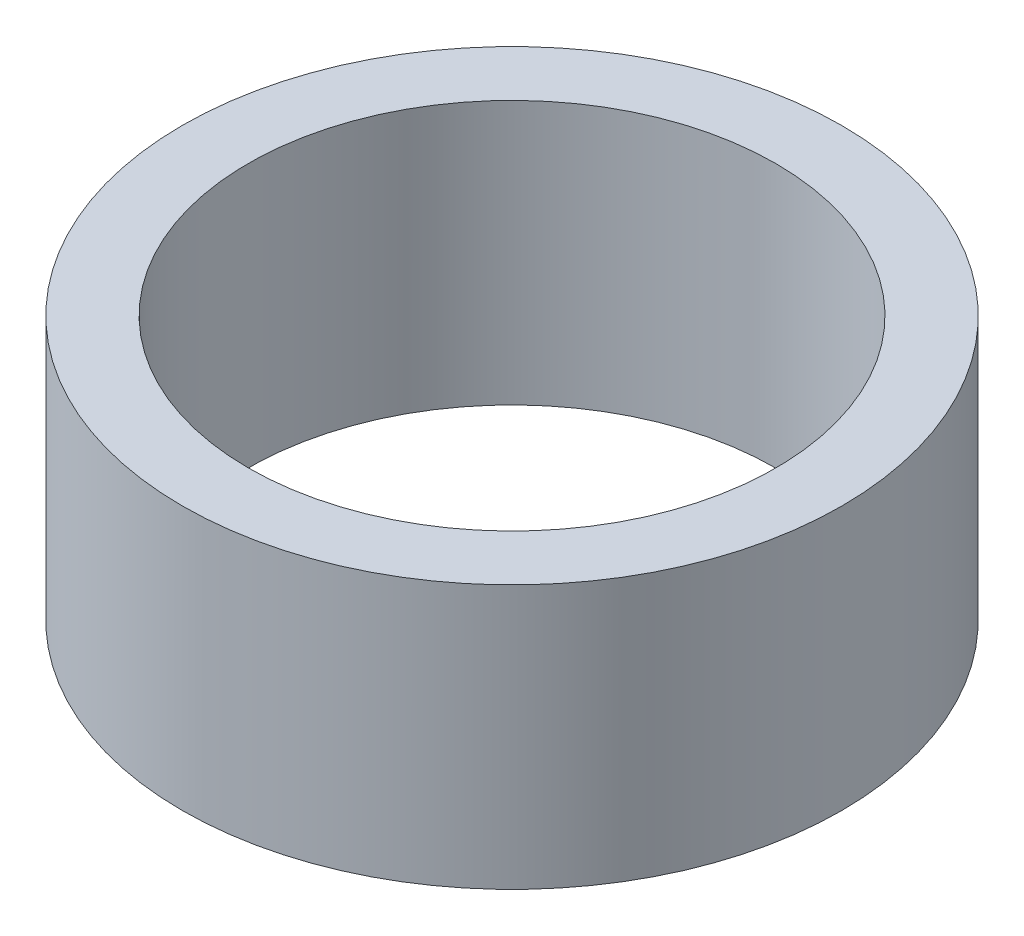
ISO-10303-21;
HEADER;
FILE_DESCRIPTION(('STEP AP214'),'2;1');
FILE_NAME('part.step','',(''),(''),'','','');
FILE_SCHEMA(('AUTOMOTIVE_DESIGN { 1 0 10303 214 1 1 1 1 }'));
ENDSEC;
DATA;
#1=APPLICATION_CONTEXT('core data for automotive mechanical design processes');
#2=APPLICATION_PROTOCOL_DEFINITION('international standard','automotive_design',2000,#1);
#3=PRODUCT_CONTEXT('',#1,'mechanical');
#4=PRODUCT('Part','Part','',(#3));
#5=PRODUCT_RELATED_PRODUCT_CATEGORY('part','',(#4));
#6=PRODUCT_DEFINITION_FORMATION('','',#4);
#7=PRODUCT_DEFINITION_CONTEXT('part definition',#1,'design');
#8=PRODUCT_DEFINITION('design','',#6,#7);
#9=PRODUCT_DEFINITION_SHAPE('','',#8);
#10=(LENGTH_UNIT() NAMED_UNIT(*) SI_UNIT(.MILLI.,.METRE.));
#11=(NAMED_UNIT(*) PLANE_ANGLE_UNIT() SI_UNIT($,.RADIAN.));
#12=(NAMED_UNIT(*) SI_UNIT($,.STERADIAN.) SOLID_ANGLE_UNIT());
#13=UNCERTAINTY_MEASURE_WITH_UNIT(LENGTH_MEASURE(1.E-05),#10,'distance_accuracy_value','');
#14=(GEOMETRIC_REPRESENTATION_CONTEXT(3) GLOBAL_UNCERTAINTY_ASSIGNED_CONTEXT((#13)) GLOBAL_UNIT_ASSIGNED_CONTEXT((#10,
#11,#12)) REPRESENTATION_CONTEXT('',''));
#15=CARTESIAN_POINT('',(0.,0.,0.));
#16=DIRECTION('',(0.,0.,1.));
#17=DIRECTION('',(1.,0.,0.));
#18=AXIS2_PLACEMENT_3D('',#15,#16,#17);
#19=CARTESIAN_POINT('',(2143.78540856377,612.534442666,668.99002422339));
#20=DIRECTION('',(-0.00012941094163007,-0.999999972257219,0.000196820653176026));
#21=DIRECTION('',(0.,-0.000196820654824123,-0.999999980630815));
#22=AXIS2_PLACEMENT_3D('',#19,#20,#21);
#23=CYLINDRICAL_SURFACE('',#22,4.99999999999995);
#24=CARTESIAN_POINT('',(2143.78540856377,612.534442666,668.99002422339));
#25=DIRECTION('',(-0.00012941094163007,-0.999999972257219,0.000196820653176026));
#26=DIRECTION('',(0.,0.000196820654824123,0.999999980630815));
#27=AXIS2_PLACEMENT_3D('',#24,#25,#26);
#28=CIRCLE('',#27,4.99999999999995);
#29=CARTESIAN_POINT('',(2143.78540856377,612.535426769275,673.990024126544));
#30=VERTEX_POINT('',#29);
#31=EDGE_CURVE('E10',#30,#30,#28,.T.);
#32=ORIENTED_EDGE('',*,*,#31,.T.);
#33=EDGE_LOOP('',(#32));
#34=FACE_BOUND('',#33,.T.);
#35=CARTESIAN_POINT('',(2143.78489092,608.534442777,668.990811506003));
#36=DIRECTION('',(-0.00012941094163007,-0.999999972257219,0.000196820653176026));
#37=DIRECTION('',(0.,0.000196820654824123,0.999999980630815));
#38=AXIS2_PLACEMENT_3D('',#35,#36,#37);
#39=CIRCLE('',#38,4.99999999999995);
#40=CARTESIAN_POINT('',(2143.78489092,608.535426880274,673.990811409157));
#41=VERTEX_POINT('',#40);
#42=EDGE_CURVE('E35',#41,#41,#39,.T.);
#43=ORIENTED_EDGE('',*,*,#42,.F.);
#44=EDGE_LOOP('',(#43));
#45=FACE_BOUND('',#44,.T.);
#46=ADVANCED_FACE('F29',(#34,#45),#23,.T.);
#47=CARTESIAN_POINT('',(2143.78540856377,612.534442666,668.99002422339));
#48=DIRECTION('',(0.00012941094163007,0.999999972257219,-0.000196820653176026));
#49=DIRECTION('',(0.,0.000196820654824123,0.999999980630815));
#50=AXIS2_PLACEMENT_3D('',#47,#48,#49);
#51=PLANE('',#50);
#52=CARTESIAN_POINT('',(2143.78540856377,612.534442666,668.99002422339));
#53=DIRECTION('',(-0.00012941094163007,-0.999999972257219,0.000196820653176026));
#54=DIRECTION('',(0.,0.000196820654824123,0.999999980630815));
#55=AXIS2_PLACEMENT_3D('',#52,#53,#54);
#56=CIRCLE('',#55,3.99999999999994);
#57=CARTESIAN_POINT('',(2143.78540856377,612.53522994862,672.990024145913));
#58=VERTEX_POINT('',#57);
#59=EDGE_CURVE('E39',#58,#58,#56,.T.);
#60=ORIENTED_EDGE('',*,*,#59,.T.);
#61=EDGE_LOOP('',(#60));
#62=FACE_BOUND('',#61,.T.);
#63=ORIENTED_EDGE('',*,*,#31,.F.);
#64=EDGE_LOOP('',(#63));
#65=FACE_BOUND('',#64,.T.);
#66=ADVANCED_FACE('F53',(#62,#65),#51,.T.);
#67=CARTESIAN_POINT('',(2143.78489092,608.534442777,668.990811506003));
#68=DIRECTION('',(0.00012941094163007,0.999999972257219,-0.000196820653176026));
#69=DIRECTION('',(0.,0.000196820654824123,0.999999980630815));
#70=AXIS2_PLACEMENT_3D('',#67,#68,#69);
#71=PLANE('',#70);
#72=CARTESIAN_POINT('',(2143.78489092,608.534442777,668.990811506003));
#73=DIRECTION('',(-0.00012941094163007,-0.999999972257219,0.000196820653176026));
#74=DIRECTION('',(0.,0.000196820654824123,0.999999980630815));
#75=AXIS2_PLACEMENT_3D('',#72,#73,#74);
#76=CIRCLE('',#75,3.99999999999994);
#77=CARTESIAN_POINT('',(2143.78489092,608.535230059619,672.990811428526));
#78=VERTEX_POINT('',#77);
#79=EDGE_CURVE('E43',#78,#78,#76,.T.);
#80=ORIENTED_EDGE('',*,*,#79,.F.);
#81=EDGE_LOOP('',(#80));
#82=FACE_BOUND('',#81,.T.);
#83=ORIENTED_EDGE('',*,*,#42,.T.);
#84=EDGE_LOOP('',(#83));
#85=FACE_BOUND('',#84,.T.);
#86=ADVANCED_FACE('F51',(#82,#85),#71,.F.);
#87=CARTESIAN_POINT('',(2143.78540856377,612.534442666,668.99002422339));
#88=DIRECTION('',(-0.00012941094163007,-0.999999972257219,0.000196820653176026));
#89=DIRECTION('',(0.,-0.000196820654824123,-0.999999980630815));
#90=AXIS2_PLACEMENT_3D('',#87,#88,#89);
#91=CYLINDRICAL_SURFACE('',#90,3.99999999999994);
#92=ORIENTED_EDGE('',*,*,#59,.F.);
#93=EDGE_LOOP('',(#92));
#94=FACE_BOUND('',#93,.T.);
#95=ORIENTED_EDGE('',*,*,#79,.T.);
#96=EDGE_LOOP('',(#95));
#97=FACE_BOUND('',#96,.T.);
#98=ADVANCED_FACE('F49',(#94,#97),#91,.F.);
#99=CLOSED_SHELL('',(#46,#66,#86,#98));
#100=MANIFOLD_SOLID_BREP('B2',#99);
#101=ADVANCED_BREP_SHAPE_REPRESENTATION('',(#18,#100),#14);
#102=SHAPE_DEFINITION_REPRESENTATION(#9,#101);
ENDSEC;
END-ISO-10303-21;
